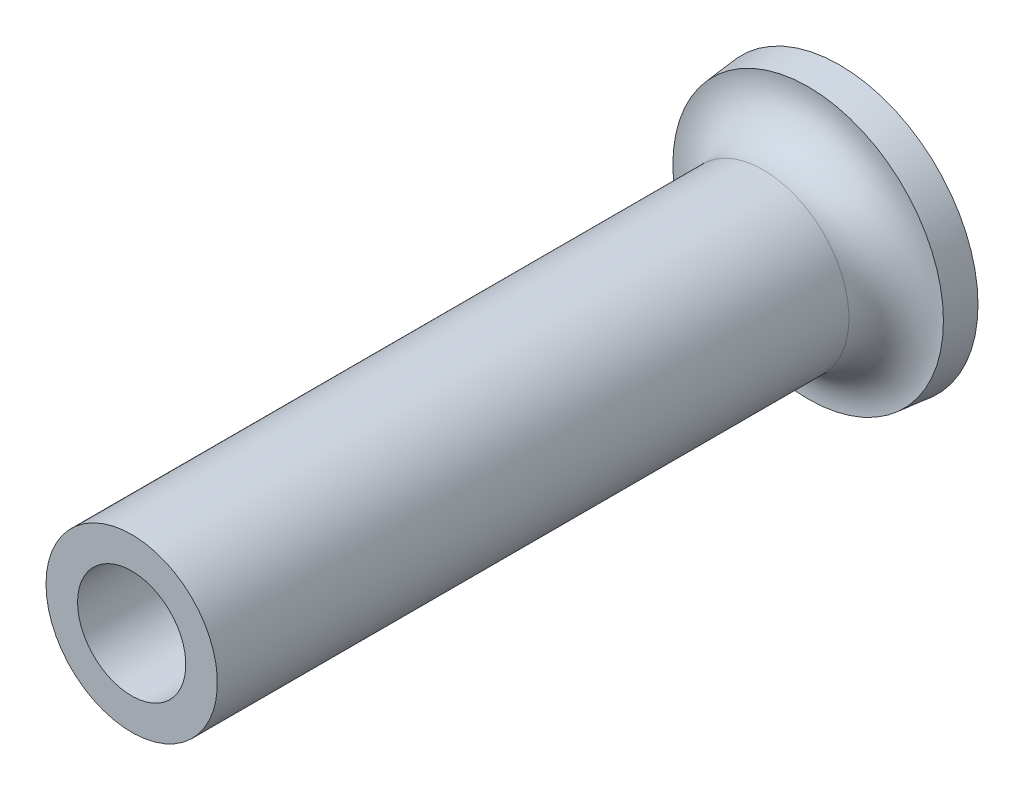
ISO-10303-21;
HEADER;
FILE_DESCRIPTION(('STEP AP214'),'2;1');
FILE_NAME('part.step','',(''),(''),'','','');
FILE_SCHEMA(('AUTOMOTIVE_DESIGN { 1 0 10303 214 1 1 1 1 }'));
ENDSEC;
DATA;
#1=APPLICATION_CONTEXT('core data for automotive mechanical design processes');
#2=APPLICATION_PROTOCOL_DEFINITION('international standard','automotive_design',2000,#1);
#3=PRODUCT_CONTEXT('',#1,'mechanical');
#4=PRODUCT('Part','Part','',(#3));
#5=PRODUCT_RELATED_PRODUCT_CATEGORY('part','',(#4));
#6=PRODUCT_DEFINITION_FORMATION('','',#4);
#7=PRODUCT_DEFINITION_CONTEXT('part definition',#1,'design');
#8=PRODUCT_DEFINITION('design','',#6,#7);
#9=PRODUCT_DEFINITION_SHAPE('','',#8);
#10=(LENGTH_UNIT() NAMED_UNIT(*) SI_UNIT(.MILLI.,.METRE.));
#11=(NAMED_UNIT(*) PLANE_ANGLE_UNIT() SI_UNIT($,.RADIAN.));
#12=(NAMED_UNIT(*) SI_UNIT($,.STERADIAN.) SOLID_ANGLE_UNIT());
#13=UNCERTAINTY_MEASURE_WITH_UNIT(LENGTH_MEASURE(1.E-05),#10,'distance_accuracy_value','');
#14=(GEOMETRIC_REPRESENTATION_CONTEXT(3) GLOBAL_UNCERTAINTY_ASSIGNED_CONTEXT((#13)) GLOBAL_UNIT_ASSIGNED_CONTEXT((#10,
#11,#12)) REPRESENTATION_CONTEXT('',''));
#15=CARTESIAN_POINT('',(0.,0.,0.));
#16=DIRECTION('',(0.,0.,1.));
#17=DIRECTION('',(1.,0.,0.));
#18=AXIS2_PLACEMENT_3D('',#15,#16,#17);
#19=CARTESIAN_POINT('',(0.,0.,0.));
#20=DIRECTION('',(0.,0.,-1.));
#21=DIRECTION('',(-1.,0.,0.));
#22=AXIS2_PLACEMENT_3D('',#19,#20,#21);
#23=TOROIDAL_SURFACE('',#22,2.9,1.7);
#24=CARTESIAN_POINT('',(0.,0.,-1.69147864308125));
#25=DIRECTION('',(0.,0.,-1.));
#26=DIRECTION('',(-1.,0.,0.));
#27=AXIS2_PLACEMENT_3D('',#24,#25,#26);
#28=CIRCLE('',#27,3.07);
#29=CARTESIAN_POINT('',(-3.07,0.,-1.69147864308125));
#30=VERTEX_POINT('',#29);
#31=EDGE_CURVE('E10',#30,#30,#28,.T.);
#32=ORIENTED_EDGE('',*,*,#31,.T.);
#33=EDGE_LOOP('',(#32));
#34=FACE_BOUND('',#33,.T.);
#35=CARTESIAN_POINT('',(0.,0.,0.));
#36=DIRECTION('',(0.,0.,-1.));
#37=DIRECTION('',(-1.,0.,0.));
#38=AXIS2_PLACEMENT_3D('',#35,#36,#37);
#39=CIRCLE('',#38,1.2);
#40=CARTESIAN_POINT('',(-1.2,0.,0.));
#41=VERTEX_POINT('',#40);
#42=EDGE_CURVE('E52',#41,#41,#39,.T.);
#43=ORIENTED_EDGE('',*,*,#42,.F.);
#44=EDGE_LOOP('',(#43));
#45=FACE_BOUND('',#44,.T.);
#46=ADVANCED_FACE('F30',(#34,#45),#23,.T.);
#47=CARTESIAN_POINT('',(0.,0.,-0.99498743710662));
#48=DIRECTION('',(0.,0.,-1.));
#49=DIRECTION('',(-1.,0.,0.));
#50=AXIS2_PLACEMENT_3D('',#47,#48,#49);
#51=CONICAL_SURFACE('',#50,3.,0.100167421161559);
#52=ORIENTED_EDGE('',*,*,#31,.F.);
#53=EDGE_LOOP('',(#52));
#54=FACE_BOUND('',#53,.T.);
#55=CARTESIAN_POINT('',(0.,0.,-0.99498743710662));
#56=DIRECTION('',(0.,0.,-1.));
#57=DIRECTION('',(-1.,0.,0.));
#58=AXIS2_PLACEMENT_3D('',#55,#56,#57);
#59=CIRCLE('',#58,3.);
#60=CARTESIAN_POINT('',(-3.,0.,-0.99498743710662));
#61=VERTEX_POINT('',#60);
#62=EDGE_CURVE('E36',#61,#61,#59,.T.);
#63=ORIENTED_EDGE('',*,*,#62,.T.);
#64=EDGE_LOOP('',(#63));
#65=FACE_BOUND('',#64,.T.);
#66=ADVANCED_FACE('F60',(#54,#65),#51,.T.);
#67=CARTESIAN_POINT('',(0.,0.,0.));
#68=DIRECTION('',(0.,0.,-1.));
#69=DIRECTION('',(-1.,0.,0.));
#70=AXIS2_PLACEMENT_3D('',#67,#68,#69);
#71=TOROIDAL_SURFACE('',#70,2.9,1.);
#72=ORIENTED_EDGE('',*,*,#62,.F.);
#73=EDGE_LOOP('',(#72));
#74=FACE_BOUND('',#73,.T.);
#75=CARTESIAN_POINT('',(0.,0.,0.));
#76=DIRECTION('',(0.,0.,-1.));
#77=DIRECTION('',(-1.,0.,0.));
#78=AXIS2_PLACEMENT_3D('',#75,#76,#77);
#79=CIRCLE('',#78,1.9);
#80=CARTESIAN_POINT('',(-1.9,0.,0.));
#81=VERTEX_POINT('',#80);
#82=EDGE_CURVE('E40',#81,#81,#79,.T.);
#83=ORIENTED_EDGE('',*,*,#82,.T.);
#84=EDGE_LOOP('',(#83));
#85=FACE_BOUND('',#84,.T.);
#86=ADVANCED_FACE('F64',(#74,#85),#71,.F.);
#87=CARTESIAN_POINT('',(0.,0.,0.));
#88=DIRECTION('',(0.,0.,-1.));
#89=DIRECTION('',(-1.,0.,0.));
#90=AXIS2_PLACEMENT_3D('',#87,#88,#89);
#91=CYLINDRICAL_SURFACE('',#90,1.9);
#92=ORIENTED_EDGE('',*,*,#82,.F.);
#93=EDGE_LOOP('',(#92));
#94=FACE_BOUND('',#93,.T.);
#95=CARTESIAN_POINT('',(0.,0.,14.0050125628934));
#96=DIRECTION('',(0.,0.,-1.));
#97=DIRECTION('',(-1.,0.,0.));
#98=AXIS2_PLACEMENT_3D('',#95,#96,#97);
#99=CIRCLE('',#98,1.9);
#100=CARTESIAN_POINT('',(-1.9,0.,14.0050125628934));
#101=VERTEX_POINT('',#100);
#102=EDGE_CURVE('E44',#101,#101,#99,.T.);
#103=ORIENTED_EDGE('',*,*,#102,.T.);
#104=EDGE_LOOP('',(#103));
#105=FACE_BOUND('',#104,.T.);
#106=ADVANCED_FACE('F69',(#94,#105),#91,.T.);
#107=CARTESIAN_POINT('',(0.,1.2,14.0050125628934));
#108=DIRECTION('',(0.,0.,-1.));
#109=DIRECTION('',(-1.,0.,0.));
#110=AXIS2_PLACEMENT_3D('',#107,#108,#109);
#111=PLANE('',#110);
#112=ORIENTED_EDGE('',*,*,#102,.F.);
#113=EDGE_LOOP('',(#112));
#114=FACE_BOUND('',#113,.T.);
#115=CARTESIAN_POINT('',(0.,0.,14.0050125628934));
#116=DIRECTION('',(0.,0.,-1.));
#117=DIRECTION('',(-1.,0.,0.));
#118=AXIS2_PLACEMENT_3D('',#115,#116,#117);
#119=CIRCLE('',#118,1.2);
#120=CARTESIAN_POINT('',(-1.2,0.,14.0050125628934));
#121=VERTEX_POINT('',#120);
#122=EDGE_CURVE('E49',#121,#121,#119,.T.);
#123=ORIENTED_EDGE('',*,*,#122,.T.);
#124=EDGE_LOOP('',(#123));
#125=FACE_BOUND('',#124,.T.);
#126=ADVANCED_FACE('F75',(#114,#125),#111,.F.);
#127=CARTESIAN_POINT('',(0.,0.,0.));
#128=DIRECTION('',(0.,0.,-1.));
#129=DIRECTION('',(-1.,0.,0.));
#130=AXIS2_PLACEMENT_3D('',#127,#128,#129);
#131=CYLINDRICAL_SURFACE('',#130,1.2);
#132=ORIENTED_EDGE('',*,*,#42,.T.);
#133=EDGE_LOOP('',(#132));
#134=FACE_BOUND('',#133,.T.);
#135=ORIENTED_EDGE('',*,*,#122,.F.);
#136=EDGE_LOOP('',(#135));
#137=FACE_BOUND('',#136,.T.);
#138=ADVANCED_FACE('F56',(#134,#137),#131,.F.);
#139=CLOSED_SHELL('',(#46,#66,#86,#106,#126,#138));
#140=MANIFOLD_SOLID_BREP('B2',#139);
#141=ADVANCED_BREP_SHAPE_REPRESENTATION('',(#18,#140),#14);
#142=SHAPE_DEFINITION_REPRESENTATION(#9,#141);
ENDSEC;
END-ISO-10303-21;
